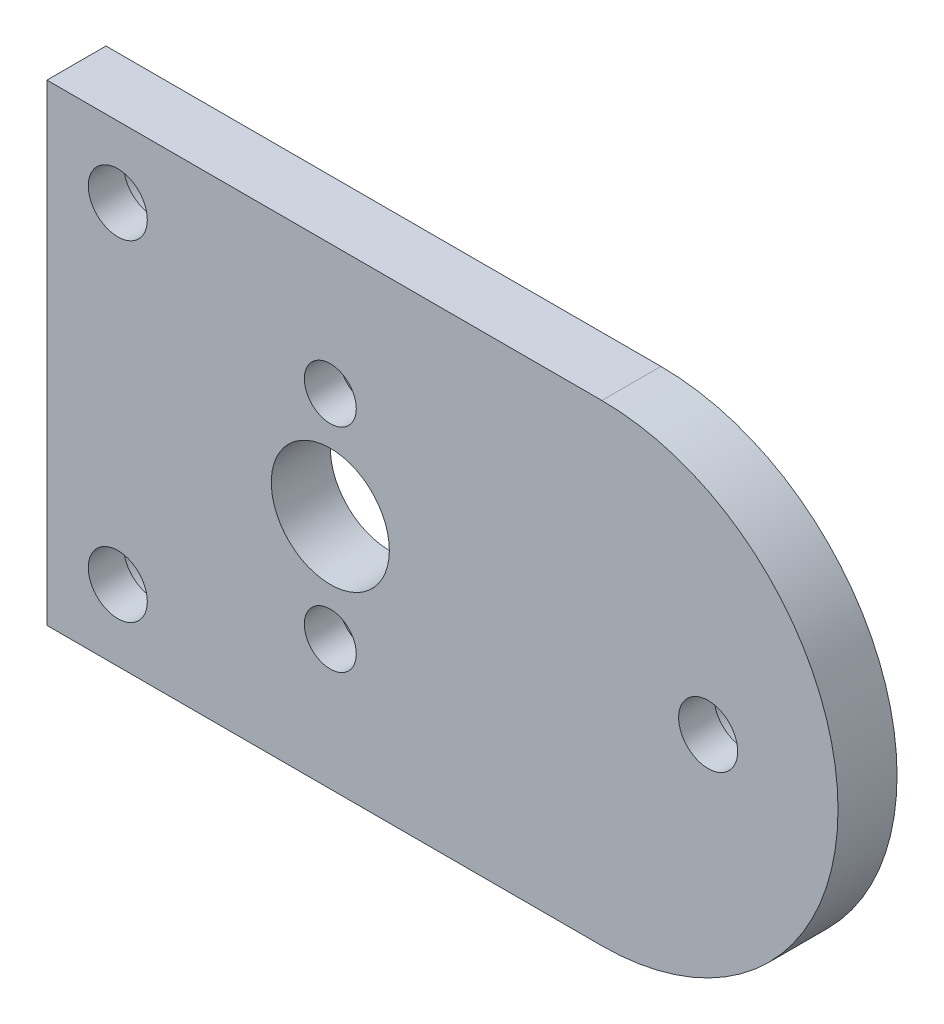
ISO-10303-21;
HEADER;
FILE_DESCRIPTION(('STEP AP214'),'2;1');
FILE_NAME('part.step','',(''),(''),'','','');
FILE_SCHEMA(('AUTOMOTIVE_DESIGN { 1 0 10303 214 1 1 1 1 }'));
ENDSEC;
DATA;
#1=APPLICATION_CONTEXT('core data for automotive mechanical design processes');
#2=APPLICATION_PROTOCOL_DEFINITION('international standard','automotive_design',2000,#1);
#3=PRODUCT_CONTEXT('',#1,'mechanical');
#4=PRODUCT('Part','Part','',(#3));
#5=PRODUCT_RELATED_PRODUCT_CATEGORY('part','',(#4));
#6=PRODUCT_DEFINITION_FORMATION('','',#4);
#7=PRODUCT_DEFINITION_CONTEXT('part definition',#1,'design');
#8=PRODUCT_DEFINITION('design','',#6,#7);
#9=PRODUCT_DEFINITION_SHAPE('','',#8);
#10=(LENGTH_UNIT() NAMED_UNIT(*) SI_UNIT(.MILLI.,.METRE.));
#11=(NAMED_UNIT(*) PLANE_ANGLE_UNIT() SI_UNIT($,.RADIAN.));
#12=(NAMED_UNIT(*) SI_UNIT($,.STERADIAN.) SOLID_ANGLE_UNIT());
#13=UNCERTAINTY_MEASURE_WITH_UNIT(LENGTH_MEASURE(1.E-05),#10,'distance_accuracy_value','');
#14=(GEOMETRIC_REPRESENTATION_CONTEXT(3) GLOBAL_UNCERTAINTY_ASSIGNED_CONTEXT((#13)) GLOBAL_UNIT_ASSIGNED_CONTEXT((#10,
#11,#12)) REPRESENTATION_CONTEXT('',''));
#15=CARTESIAN_POINT('',(0.,0.,0.));
#16=DIRECTION('',(0.,0.,1.));
#17=DIRECTION('',(1.,0.,0.));
#18=AXIS2_PLACEMENT_3D('',#15,#16,#17);
#19=CARTESIAN_POINT('',(0.,4.5,1.25));
#20=DIRECTION('',(0.,0.,-1.));
#21=DIRECTION('',(-1.,0.,0.));
#22=AXIS2_PLACEMENT_3D('',#19,#20,#21);
#23=CYLINDRICAL_SURFACE('',#22,0.85);
#24=CARTESIAN_POINT('',(0.,4.5,-1.25));
#25=DIRECTION('',(0.,0.,1.));
#26=DIRECTION('',(1.,0.,0.));
#27=AXIS2_PLACEMENT_3D('',#24,#25,#26);
#28=CIRCLE('',#27,0.85);
#29=CARTESIAN_POINT('',(0.849999999999998,4.5,-1.25));
#30=VERTEX_POINT('',#29);
#31=EDGE_CURVE('E184',#30,#30,#28,.T.);
#32=ORIENTED_EDGE('',*,*,#31,.F.);
#33=EDGE_LOOP('',(#32));
#34=FACE_BOUND('',#33,.T.);
#35=CARTESIAN_POINT('',(0.,4.5,-0.25));
#36=DIRECTION('',(0.,0.,1.));
#37=DIRECTION('',(1.,0.,0.));
#38=AXIS2_PLACEMENT_3D('',#35,#36,#37);
#39=CIRCLE('',#38,0.85);
#40=CARTESIAN_POINT('',(0.849999999999998,4.5,-0.25));
#41=VERTEX_POINT('',#40);
#42=EDGE_CURVE('E197',#41,#41,#39,.T.);
#43=ORIENTED_EDGE('',*,*,#42,.T.);
#44=EDGE_LOOP('',(#43));
#45=FACE_BOUND('',#44,.T.);
#46=ADVANCED_FACE('F118',(#34,#45),#23,.F.);
#47=CARTESIAN_POINT('',(0.,-4.5,1.25));
#48=DIRECTION('',(0.,0.,-1.));
#49=DIRECTION('',(-1.,0.,0.));
#50=AXIS2_PLACEMENT_3D('',#47,#48,#49);
#51=CYLINDRICAL_SURFACE('',#50,0.85);
#52=CARTESIAN_POINT('',(0.,-4.5,-1.25));
#53=DIRECTION('',(0.,0.,1.));
#54=DIRECTION('',(1.,0.,0.));
#55=AXIS2_PLACEMENT_3D('',#52,#53,#54);
#56=CIRCLE('',#55,0.85);
#57=CARTESIAN_POINT('',(0.850000000000001,-4.5,-1.25));
#58=VERTEX_POINT('',#57);
#59=EDGE_CURVE('E188',#58,#58,#56,.T.);
#60=ORIENTED_EDGE('',*,*,#59,.F.);
#61=EDGE_LOOP('',(#60));
#62=FACE_BOUND('',#61,.T.);
#63=CARTESIAN_POINT('',(0.,-4.5,-0.25));
#64=DIRECTION('',(0.,0.,1.));
#65=DIRECTION('',(1.,0.,0.));
#66=AXIS2_PLACEMENT_3D('',#63,#64,#65);
#67=CIRCLE('',#66,0.85);
#68=CARTESIAN_POINT('',(0.850000000000001,-4.5,-0.25));
#69=VERTEX_POINT('',#68);
#70=EDGE_CURVE('E208',#69,#69,#67,.T.);
#71=ORIENTED_EDGE('',*,*,#70,.T.);
#72=EDGE_LOOP('',(#71));
#73=FACE_BOUND('',#72,.T.);
#74=ADVANCED_FACE('F265',(#62,#73),#51,.F.);
#75=CARTESIAN_POINT('',(0.,10.0000000000001,1.25));
#76=DIRECTION('',(0.,-1.,0.));
#77=DIRECTION('',(1.,0.,0.));
#78=AXIS2_PLACEMENT_3D('',#75,#76,#77);
#79=PLANE('',#78);
#80=DIRECTION('',(-1.,0.,0.));
#81=VECTOR('',#80,1.);
#82=CARTESIAN_POINT('',(0.,10.0000000000001,-1.25));
#83=LINE('',#82,#81);
#84=CARTESIAN_POINT('',(11.5,10.,-1.25));
#85=VERTEX_POINT('',#84);
#86=CARTESIAN_POINT('',(-12.,10.,-1.25));
#87=VERTEX_POINT('',#86);
#88=EDGE_CURVE('E161',#85,#87,#83,.T.);
#89=ORIENTED_EDGE('',*,*,#88,.T.);
#90=DIRECTION('',(0.,0.,-1.));
#91=VECTOR('',#90,1.);
#92=CARTESIAN_POINT('',(-12.,10.,1.25));
#93=LINE('',#92,#91);
#94=CARTESIAN_POINT('',(-12.,10.,1.25));
#95=VERTEX_POINT('',#94);
#96=EDGE_CURVE('E13',#95,#87,#93,.T.);
#97=ORIENTED_EDGE('',*,*,#96,.F.);
#98=DIRECTION('',(-1.,0.,0.));
#99=VECTOR('',#98,1.);
#100=CARTESIAN_POINT('',(0.,10.0000000000001,1.25));
#101=LINE('',#100,#99);
#102=CARTESIAN_POINT('',(11.5,10.,1.25));
#103=VERTEX_POINT('',#102);
#104=EDGE_CURVE('E176',#103,#95,#101,.T.);
#105=ORIENTED_EDGE('',*,*,#104,.F.);
#106=DIRECTION('',(0.,0.,-1.));
#107=VECTOR('',#106,1.);
#108=CARTESIAN_POINT('',(11.5,10.,1.25));
#109=LINE('',#108,#107);
#110=EDGE_CURVE('E174',#103,#85,#109,.T.);
#111=ORIENTED_EDGE('',*,*,#110,.T.);
#112=EDGE_LOOP('',(#89,#97,#105,#111));
#113=FACE_BOUND('',#112,.T.);
#114=ADVANCED_FACE('F175',(#113),#79,.F.);
#115=CARTESIAN_POINT('',(-12.,0.,1.25));
#116=DIRECTION('',(1.,0.,0.));
#117=DIRECTION('',(0.,1.,0.));
#118=AXIS2_PLACEMENT_3D('',#115,#116,#117);
#119=PLANE('',#118);
#120=DIRECTION('',(0.,-1.,0.));
#121=VECTOR('',#120,1.);
#122=CARTESIAN_POINT('',(-12.,0.,-1.25));
#123=LINE('',#122,#121);
#124=CARTESIAN_POINT('',(-12.,-10.,-1.25));
#125=VERTEX_POINT('',#124);
#126=EDGE_CURVE('E168',#87,#125,#123,.T.);
#127=ORIENTED_EDGE('',*,*,#126,.T.);
#128=DIRECTION('',(0.,0.,-1.));
#129=VECTOR('',#128,1.);
#130=CARTESIAN_POINT('',(-12.,-10.,1.25));
#131=LINE('',#130,#129);
#132=CARTESIAN_POINT('',(-12.,-10.,1.25));
#133=VERTEX_POINT('',#132);
#134=EDGE_CURVE('E127',#133,#125,#131,.T.);
#135=ORIENTED_EDGE('',*,*,#134,.F.);
#136=DIRECTION('',(0.,-1.,0.));
#137=VECTOR('',#136,1.);
#138=CARTESIAN_POINT('',(-12.,0.,1.25));
#139=LINE('',#138,#137);
#140=EDGE_CURVE('E136',#95,#133,#139,.T.);
#141=ORIENTED_EDGE('',*,*,#140,.F.);
#142=ORIENTED_EDGE('',*,*,#96,.T.);
#143=EDGE_LOOP('',(#127,#135,#141,#142));
#144=FACE_BOUND('',#143,.T.);
#145=ADVANCED_FACE('F245',(#144),#119,.F.);
#146=CARTESIAN_POINT('',(0.,-10.,1.25));
#147=DIRECTION('',(0.,-1.,0.));
#148=DIRECTION('',(0.,0.,-1.));
#149=AXIS2_PLACEMENT_3D('',#146,#147,#148);
#150=PLANE('',#149);
#151=DIRECTION('',(-1.,0.,0.));
#152=VECTOR('',#151,1.);
#153=CARTESIAN_POINT('',(0.,-10.,-1.25));
#154=LINE('',#153,#152);
#155=CARTESIAN_POINT('',(11.5,-10.,-1.25));
#156=VERTEX_POINT('',#155);
#157=EDGE_CURVE('E155',#156,#125,#154,.T.);
#158=ORIENTED_EDGE('',*,*,#157,.F.);
#159=DIRECTION('',(0.,0.,-1.));
#160=VECTOR('',#159,1.);
#161=CARTESIAN_POINT('',(11.5,-10.,1.25));
#162=LINE('',#161,#160);
#163=CARTESIAN_POINT('',(11.5,-10.,1.25));
#164=VERTEX_POINT('',#163);
#165=EDGE_CURVE('E171',#164,#156,#162,.T.);
#166=ORIENTED_EDGE('',*,*,#165,.F.);
#167=DIRECTION('',(-1.,0.,0.));
#168=VECTOR('',#167,1.);
#169=CARTESIAN_POINT('',(0.,-10.,1.25));
#170=LINE('',#169,#168);
#171=EDGE_CURVE('E238',#164,#133,#170,.T.);
#172=ORIENTED_EDGE('',*,*,#171,.T.);
#173=ORIENTED_EDGE('',*,*,#134,.T.);
#174=EDGE_LOOP('',(#158,#166,#172,#173));
#175=FACE_BOUND('',#174,.T.);
#176=ADVANCED_FACE('F243',(#175),#150,.T.);
#177=CARTESIAN_POINT('',(0.,0.,1.25));
#178=DIRECTION('',(0.,0.,1.));
#179=DIRECTION('',(1.,0.,0.));
#180=AXIS2_PLACEMENT_3D('',#177,#178,#179);
#181=PLANE('',#180);
#182=CARTESIAN_POINT('',(0.,4.5,1.25));
#183=DIRECTION('',(0.,0.,1.));
#184=DIRECTION('',(1.,0.,0.));
#185=AXIS2_PLACEMENT_3D('',#182,#183,#184);
#186=CIRCLE('',#185,1.1);
#187=CARTESIAN_POINT('',(1.1,4.5,1.25));
#188=VERTEX_POINT('',#187);
#189=EDGE_CURVE('E231',#188,#188,#186,.T.);
#190=ORIENTED_EDGE('',*,*,#189,.F.);
#191=EDGE_LOOP('',(#190));
#192=FACE_BOUND('',#191,.T.);
#193=CARTESIAN_POINT('',(0.,-4.5,1.25));
#194=DIRECTION('',(0.,0.,1.));
#195=DIRECTION('',(1.,0.,0.));
#196=AXIS2_PLACEMENT_3D('',#193,#194,#195);
#197=CIRCLE('',#196,1.1);
#198=CARTESIAN_POINT('',(1.1,-4.5,1.25));
#199=VERTEX_POINT('',#198);
#200=EDGE_CURVE('E226',#199,#199,#197,.T.);
#201=ORIENTED_EDGE('',*,*,#200,.F.);
#202=EDGE_LOOP('',(#201));
#203=FACE_BOUND('',#202,.T.);
#204=ORIENTED_EDGE('',*,*,#104,.T.);
#205=ORIENTED_EDGE('',*,*,#140,.T.);
#206=ORIENTED_EDGE('',*,*,#171,.F.);
#207=CARTESIAN_POINT('',(11.5,0.,1.25));
#208=DIRECTION('',(0.,0.,1.));
#209=DIRECTION('',(1.,0.,0.));
#210=AXIS2_PLACEMENT_3D('',#207,#208,#209);
#211=CIRCLE('',#210,10.);
#212=EDGE_CURVE('E183',#164,#103,#211,.T.);
#213=ORIENTED_EDGE('',*,*,#212,.T.);
#214=EDGE_LOOP('',(#204,#205,#206,#213));
#215=FACE_BOUND('',#214,.T.);
#216=CARTESIAN_POINT('',(-9.00000000000001,7.,1.25));
#217=DIRECTION('',(0.,0.,1.));
#218=DIRECTION('',(1.,0.,0.));
#219=AXIS2_PLACEMENT_3D('',#216,#217,#218);
#220=CIRCLE('',#219,1.25);
#221=CARTESIAN_POINT('',(-7.75000000000001,7.,1.25));
#222=VERTEX_POINT('',#221);
#223=EDGE_CURVE('E196',#222,#222,#220,.T.);
#224=ORIENTED_EDGE('',*,*,#223,.F.);
#225=EDGE_LOOP('',(#224));
#226=FACE_BOUND('',#225,.T.);
#227=CARTESIAN_POINT('',(0.,0.,1.25));
#228=DIRECTION('',(0.,0.,1.));
#229=DIRECTION('',(1.,0.,0.));
#230=AXIS2_PLACEMENT_3D('',#227,#228,#229);
#231=CIRCLE('',#230,2.5);
#232=CARTESIAN_POINT('',(2.5,0.,1.25));
#233=VERTEX_POINT('',#232);
#234=EDGE_CURVE('E201',#233,#233,#231,.T.);
#235=ORIENTED_EDGE('',*,*,#234,.F.);
#236=EDGE_LOOP('',(#235));
#237=FACE_BOUND('',#236,.T.);
#238=CARTESIAN_POINT('',(-9.00000000000001,-7.,1.25));
#239=DIRECTION('',(0.,0.,1.));
#240=DIRECTION('',(1.,0.,0.));
#241=AXIS2_PLACEMENT_3D('',#238,#239,#240);
#242=CIRCLE('',#241,1.25);
#243=CARTESIAN_POINT('',(-7.75,-7.,1.25));
#244=VERTEX_POINT('',#243);
#245=EDGE_CURVE('E193',#244,#244,#242,.T.);
#246=ORIENTED_EDGE('',*,*,#245,.F.);
#247=EDGE_LOOP('',(#246));
#248=FACE_BOUND('',#247,.T.);
#249=CARTESIAN_POINT('',(16.,0.,1.25));
#250=DIRECTION('',(0.,0.,1.));
#251=DIRECTION('',(1.,0.,0.));
#252=AXIS2_PLACEMENT_3D('',#249,#250,#251);
#253=CIRCLE('',#252,1.25);
#254=CARTESIAN_POINT('',(17.25,0.,1.25));
#255=VERTEX_POINT('',#254);
#256=EDGE_CURVE('E180',#255,#255,#253,.T.);
#257=ORIENTED_EDGE('',*,*,#256,.F.);
#258=EDGE_LOOP('',(#257));
#259=FACE_BOUND('',#258,.T.);
#260=ADVANCED_FACE('F246',(#192,#203,#215,#226,#237,#248,#259),#181,.T.);
#261=CARTESIAN_POINT('',(0.,0.,-1.25));
#262=DIRECTION('',(0.,0.,1.));
#263=DIRECTION('',(1.,0.,0.));
#264=AXIS2_PLACEMENT_3D('',#261,#262,#263);
#265=PLANE('',#264);
#266=CARTESIAN_POINT('',(16.,0.,-1.25));
#267=DIRECTION('',(0.,0.,1.));
#268=DIRECTION('',(1.,0.,0.));
#269=AXIS2_PLACEMENT_3D('',#266,#267,#268);
#270=CIRCLE('',#269,2.);
#271=CARTESIAN_POINT('',(18.,0.,-1.25));
#272=VERTEX_POINT('',#271);
#273=EDGE_CURVE('E313',#272,#272,#270,.T.);
#274=ORIENTED_EDGE('',*,*,#273,.T.);
#275=EDGE_LOOP('',(#274));
#276=FACE_BOUND('',#275,.T.);
#277=CARTESIAN_POINT('',(-9.00000000000001,-7.,-1.25));
#278=DIRECTION('',(0.,0.,1.));
#279=DIRECTION('',(1.,0.,0.));
#280=AXIS2_PLACEMENT_3D('',#277,#278,#279);
#281=CIRCLE('',#280,2.);
#282=CARTESIAN_POINT('',(-7.00000000000001,-7.,-1.25));
#283=VERTEX_POINT('',#282);
#284=EDGE_CURVE('E310',#283,#283,#281,.T.);
#285=ORIENTED_EDGE('',*,*,#284,.T.);
#286=EDGE_LOOP('',(#285));
#287=FACE_BOUND('',#286,.T.);
#288=CARTESIAN_POINT('',(-9.00000000000001,7.,-1.25));
#289=DIRECTION('',(0.,0.,1.));
#290=DIRECTION('',(1.,0.,0.));
#291=AXIS2_PLACEMENT_3D('',#288,#289,#290);
#292=CIRCLE('',#291,2.);
#293=CARTESIAN_POINT('',(-7.,7.,-1.25));
#294=VERTEX_POINT('',#293);
#295=EDGE_CURVE('E303',#294,#294,#292,.T.);
#296=ORIENTED_EDGE('',*,*,#295,.T.);
#297=EDGE_LOOP('',(#296));
#298=FACE_BOUND('',#297,.T.);
#299=ORIENTED_EDGE('',*,*,#88,.F.);
#300=CARTESIAN_POINT('',(11.5,0.,-1.25));
#301=DIRECTION('',(0.,0.,1.));
#302=DIRECTION('',(1.,0.,0.));
#303=AXIS2_PLACEMENT_3D('',#300,#301,#302);
#304=CIRCLE('',#303,10.);
#305=EDGE_CURVE('E166',#156,#85,#304,.T.);
#306=ORIENTED_EDGE('',*,*,#305,.F.);
#307=ORIENTED_EDGE('',*,*,#157,.T.);
#308=ORIENTED_EDGE('',*,*,#126,.F.);
#309=EDGE_LOOP('',(#299,#306,#307,#308));
#310=FACE_BOUND('',#309,.T.);
#311=ORIENTED_EDGE('',*,*,#31,.T.);
#312=EDGE_LOOP('',(#311));
#313=FACE_BOUND('',#312,.T.);
#314=ORIENTED_EDGE('',*,*,#59,.T.);
#315=EDGE_LOOP('',(#314));
#316=FACE_BOUND('',#315,.T.);
#317=CARTESIAN_POINT('',(0.,0.,-1.25));
#318=DIRECTION('',(0.,0.,1.));
#319=DIRECTION('',(1.,0.,0.));
#320=AXIS2_PLACEMENT_3D('',#317,#318,#319);
#321=CIRCLE('',#320,2.5);
#322=CARTESIAN_POINT('',(2.5,0.,-1.25));
#323=VERTEX_POINT('',#322);
#324=EDGE_CURVE('E200',#323,#323,#321,.T.);
#325=ORIENTED_EDGE('',*,*,#324,.T.);
#326=EDGE_LOOP('',(#325));
#327=FACE_BOUND('',#326,.T.);
#328=ADVANCED_FACE('F163',(#276,#287,#298,#310,#313,#316,#327),#265,.F.);
#329=CARTESIAN_POINT('',(16.,0.,1.25));
#330=DIRECTION('',(0.,0.,-1.));
#331=DIRECTION('',(-1.,0.,0.));
#332=AXIS2_PLACEMENT_3D('',#329,#330,#331);
#333=CYLINDRICAL_SURFACE('',#332,1.25);
#334=CARTESIAN_POINT('',(16.,0.,-0.25));
#335=DIRECTION('',(0.,0.,1.));
#336=DIRECTION('',(1.,0.,0.));
#337=AXIS2_PLACEMENT_3D('',#334,#335,#336);
#338=CIRCLE('',#337,1.25);
#339=CARTESIAN_POINT('',(17.25,0.,-0.25));
#340=VERTEX_POINT('',#339);
#341=EDGE_CURVE('E121',#340,#340,#338,.T.);
#342=ORIENTED_EDGE('',*,*,#341,.F.);
#343=EDGE_LOOP('',(#342));
#344=FACE_BOUND('',#343,.T.);
#345=ORIENTED_EDGE('',*,*,#256,.T.);
#346=EDGE_LOOP('',(#345));
#347=FACE_BOUND('',#346,.T.);
#348=ADVANCED_FACE('F260',(#344,#347),#333,.F.);
#349=CARTESIAN_POINT('',(-9.00000000000001,-7.,1.25));
#350=DIRECTION('',(0.,0.,-1.));
#351=DIRECTION('',(-1.,0.,0.));
#352=AXIS2_PLACEMENT_3D('',#349,#350,#351);
#353=CYLINDRICAL_SURFACE('',#352,1.25);
#354=CARTESIAN_POINT('',(-9.00000000000001,-7.,-0.25));
#355=DIRECTION('',(0.,0.,1.));
#356=DIRECTION('',(1.,0.,0.));
#357=AXIS2_PLACEMENT_3D('',#354,#355,#356);
#358=CIRCLE('',#357,1.25);
#359=CARTESIAN_POINT('',(-7.75,-7.,-0.25));
#360=VERTEX_POINT('',#359);
#361=EDGE_CURVE('E216',#360,#360,#358,.T.);
#362=ORIENTED_EDGE('',*,*,#361,.F.);
#363=EDGE_LOOP('',(#362));
#364=FACE_BOUND('',#363,.T.);
#365=ORIENTED_EDGE('',*,*,#245,.T.);
#366=EDGE_LOOP('',(#365));
#367=FACE_BOUND('',#366,.T.);
#368=ADVANCED_FACE('F262',(#364,#367),#353,.F.);
#369=CARTESIAN_POINT('',(0.,0.,1.25));
#370=DIRECTION('',(0.,0.,-1.));
#371=DIRECTION('',(-1.,0.,0.));
#372=AXIS2_PLACEMENT_3D('',#369,#370,#371);
#373=CYLINDRICAL_SURFACE('',#372,2.5);
#374=ORIENTED_EDGE('',*,*,#234,.T.);
#375=EDGE_LOOP('',(#374));
#376=FACE_BOUND('',#375,.T.);
#377=ORIENTED_EDGE('',*,*,#324,.F.);
#378=EDGE_LOOP('',(#377));
#379=FACE_BOUND('',#378,.T.);
#380=ADVANCED_FACE('F270',(#376,#379),#373,.F.);
#381=CARTESIAN_POINT('',(-9.00000000000001,7.,1.25));
#382=DIRECTION('',(0.,0.,-1.));
#383=DIRECTION('',(-1.,0.,0.));
#384=AXIS2_PLACEMENT_3D('',#381,#382,#383);
#385=CYLINDRICAL_SURFACE('',#384,1.25);
#386=CARTESIAN_POINT('',(-9.00000000000001,7.,-0.25));
#387=DIRECTION('',(0.,0.,1.));
#388=DIRECTION('',(1.,0.,0.));
#389=AXIS2_PLACEMENT_3D('',#386,#387,#388);
#390=CIRCLE('',#389,1.25);
#391=CARTESIAN_POINT('',(-7.75000000000001,7.,-0.25));
#392=VERTEX_POINT('',#391);
#393=EDGE_CURVE('E214',#392,#392,#390,.T.);
#394=ORIENTED_EDGE('',*,*,#393,.F.);
#395=EDGE_LOOP('',(#394));
#396=FACE_BOUND('',#395,.T.);
#397=ORIENTED_EDGE('',*,*,#223,.T.);
#398=EDGE_LOOP('',(#397));
#399=FACE_BOUND('',#398,.T.);
#400=ADVANCED_FACE('F273',(#396,#399),#385,.F.);
#401=CARTESIAN_POINT('',(11.5,0.,1.25));
#402=DIRECTION('',(0.,0.,-1.));
#403=DIRECTION('',(-1.,0.,0.));
#404=AXIS2_PLACEMENT_3D('',#401,#402,#403);
#405=CYLINDRICAL_SURFACE('',#404,10.);
#406=ORIENTED_EDGE('',*,*,#305,.T.);
#407=ORIENTED_EDGE('',*,*,#110,.F.);
#408=ORIENTED_EDGE('',*,*,#212,.F.);
#409=ORIENTED_EDGE('',*,*,#165,.T.);
#410=EDGE_LOOP('',(#406,#407,#408,#409));
#411=FACE_BOUND('',#410,.T.);
#412=ADVANCED_FACE('F182',(#411),#405,.T.);
#413=CARTESIAN_POINT('',(0.,-4.5,-4.36126983722081));
#414=DIRECTION('',(0.,0.,1.));
#415=DIRECTION('',(1.,0.,0.));
#416=AXIS2_PLACEMENT_3D('',#413,#414,#415);
#417=CYLINDRICAL_SURFACE('',#416,1.1);
#418=CARTESIAN_POINT('',(0.,-4.5,-0.25));
#419=DIRECTION('',(0.,0.,1.));
#420=DIRECTION('',(1.,0.,0.));
#421=AXIS2_PLACEMENT_3D('',#418,#419,#420);
#422=CIRCLE('',#421,1.1);
#423=CARTESIAN_POINT('',(1.1,-4.5,-0.25));
#424=VERTEX_POINT('',#423);
#425=EDGE_CURVE('E222',#424,#424,#422,.F.);
#426=ORIENTED_EDGE('',*,*,#425,.T.);
#427=EDGE_LOOP('',(#426));
#428=FACE_BOUND('',#427,.T.);
#429=ORIENTED_EDGE('',*,*,#200,.T.);
#430=EDGE_LOOP('',(#429));
#431=FACE_BOUND('',#430,.T.);
#432=ADVANCED_FACE('F276',(#428,#431),#417,.F.);
#433=CARTESIAN_POINT('',(0.,0.,-0.25));
#434=DIRECTION('',(0.,0.,1.));
#435=DIRECTION('',(1.,0.,0.));
#436=AXIS2_PLACEMENT_3D('',#433,#434,#435);
#437=PLANE('',#436);
#438=ORIENTED_EDGE('',*,*,#70,.F.);
#439=EDGE_LOOP('',(#438));
#440=FACE_BOUND('',#439,.T.);
#441=ORIENTED_EDGE('',*,*,#425,.F.);
#442=EDGE_LOOP('',(#441));
#443=FACE_BOUND('',#442,.T.);
#444=ADVANCED_FACE('F350',(#440,#443),#437,.T.);
#445=CARTESIAN_POINT('',(0.,4.5,-4.36126983722081));
#446=DIRECTION('',(0.,0.,1.));
#447=DIRECTION('',(1.,0.,0.));
#448=AXIS2_PLACEMENT_3D('',#445,#446,#447);
#449=CYLINDRICAL_SURFACE('',#448,1.1);
#450=CARTESIAN_POINT('',(0.,4.5,-0.25));
#451=DIRECTION('',(0.,0.,1.));
#452=DIRECTION('',(1.,0.,0.));
#453=AXIS2_PLACEMENT_3D('',#450,#451,#452);
#454=CIRCLE('',#453,1.1);
#455=CARTESIAN_POINT('',(1.1,4.5,-0.25));
#456=VERTEX_POINT('',#455);
#457=EDGE_CURVE('E211',#456,#456,#454,.F.);
#458=ORIENTED_EDGE('',*,*,#457,.T.);
#459=EDGE_LOOP('',(#458));
#460=FACE_BOUND('',#459,.T.);
#461=ORIENTED_EDGE('',*,*,#189,.T.);
#462=EDGE_LOOP('',(#461));
#463=FACE_BOUND('',#462,.T.);
#464=ADVANCED_FACE('F294',(#460,#463),#449,.F.);
#465=CARTESIAN_POINT('',(0.,0.,-0.25));
#466=DIRECTION('',(0.,0.,1.));
#467=DIRECTION('',(1.,0.,0.));
#468=AXIS2_PLACEMENT_3D('',#465,#466,#467);
#469=PLANE('',#468);
#470=ORIENTED_EDGE('',*,*,#42,.F.);
#471=EDGE_LOOP('',(#470));
#472=FACE_BOUND('',#471,.T.);
#473=ORIENTED_EDGE('',*,*,#457,.F.);
#474=EDGE_LOOP('',(#473));
#475=FACE_BOUND('',#474,.T.);
#476=ADVANCED_FACE('F290',(#472,#475),#469,.T.);
#477=CARTESIAN_POINT('',(-9.00000000000001,7.,6.90685424949238));
#478=DIRECTION('',(0.,0.,-1.));
#479=DIRECTION('',(-1.,0.,0.));
#480=AXIS2_PLACEMENT_3D('',#477,#478,#479);
#481=CYLINDRICAL_SURFACE('',#480,2.);
#482=ORIENTED_EDGE('',*,*,#295,.F.);
#483=EDGE_LOOP('',(#482));
#484=FACE_BOUND('',#483,.T.);
#485=CARTESIAN_POINT('',(-9.00000000000001,7.,-0.25));
#486=DIRECTION('',(0.,0.,1.));
#487=DIRECTION('',(1.,0.,0.));
#488=AXIS2_PLACEMENT_3D('',#485,#486,#487);
#489=CIRCLE('',#488,2.);
#490=CARTESIAN_POINT('',(-7.,7.,-0.25));
#491=VERTEX_POINT('',#490);
#492=EDGE_CURVE('E307',#491,#491,#489,.T.);
#493=ORIENTED_EDGE('',*,*,#492,.T.);
#494=EDGE_LOOP('',(#493));
#495=FACE_BOUND('',#494,.T.);
#496=ADVANCED_FACE('F293',(#484,#495),#481,.F.);
#497=CARTESIAN_POINT('',(0.,0.,-0.25));
#498=DIRECTION('',(0.,0.,1.));
#499=DIRECTION('',(1.,0.,0.));
#500=AXIS2_PLACEMENT_3D('',#497,#498,#499);
#501=PLANE('',#500);
#502=ORIENTED_EDGE('',*,*,#393,.T.);
#503=EDGE_LOOP('',(#502));
#504=FACE_BOUND('',#503,.T.);
#505=ORIENTED_EDGE('',*,*,#492,.F.);
#506=EDGE_LOOP('',(#505));
#507=FACE_BOUND('',#506,.T.);
#508=ADVANCED_FACE('F340',(#504,#507),#501,.F.);
#509=CARTESIAN_POINT('',(-9.00000000000001,-7.,6.90685424949238));
#510=DIRECTION('',(0.,0.,-1.));
#511=DIRECTION('',(-1.,0.,0.));
#512=AXIS2_PLACEMENT_3D('',#509,#510,#511);
#513=CYLINDRICAL_SURFACE('',#512,2.);
#514=ORIENTED_EDGE('',*,*,#284,.F.);
#515=EDGE_LOOP('',(#514));
#516=FACE_BOUND('',#515,.T.);
#517=CARTESIAN_POINT('',(-9.00000000000001,-7.,-0.25));
#518=DIRECTION('',(0.,0.,1.));
#519=DIRECTION('',(1.,0.,0.));
#520=AXIS2_PLACEMENT_3D('',#517,#518,#519);
#521=CIRCLE('',#520,2.);
#522=CARTESIAN_POINT('',(-7.00000000000001,-7.,-0.25));
#523=VERTEX_POINT('',#522);
#524=EDGE_CURVE('E306',#523,#523,#521,.T.);
#525=ORIENTED_EDGE('',*,*,#524,.T.);
#526=EDGE_LOOP('',(#525));
#527=FACE_BOUND('',#526,.T.);
#528=ADVANCED_FACE('F337',(#516,#527),#513,.F.);
#529=CARTESIAN_POINT('',(0.,0.,-0.25));
#530=DIRECTION('',(0.,0.,1.));
#531=DIRECTION('',(1.,0.,0.));
#532=AXIS2_PLACEMENT_3D('',#529,#530,#531);
#533=PLANE('',#532);
#534=ORIENTED_EDGE('',*,*,#361,.T.);
#535=EDGE_LOOP('',(#534));
#536=FACE_BOUND('',#535,.T.);
#537=ORIENTED_EDGE('',*,*,#524,.F.);
#538=EDGE_LOOP('',(#537));
#539=FACE_BOUND('',#538,.T.);
#540=ADVANCED_FACE('F326',(#536,#539),#533,.F.);
#541=CARTESIAN_POINT('',(16.,0.,6.90685424949238));
#542=DIRECTION('',(0.,0.,-1.));
#543=DIRECTION('',(-1.,0.,0.));
#544=AXIS2_PLACEMENT_3D('',#541,#542,#543);
#545=CYLINDRICAL_SURFACE('',#544,2.);
#546=ORIENTED_EDGE('',*,*,#273,.F.);
#547=EDGE_LOOP('',(#546));
#548=FACE_BOUND('',#547,.T.);
#549=CARTESIAN_POINT('',(16.,0.,-0.25));
#550=DIRECTION('',(0.,0.,1.));
#551=DIRECTION('',(1.,0.,0.));
#552=AXIS2_PLACEMENT_3D('',#549,#550,#551);
#553=CIRCLE('',#552,2.);
#554=CARTESIAN_POINT('',(18.,0.,-0.25));
#555=VERTEX_POINT('',#554);
#556=EDGE_CURVE('E217',#555,#555,#553,.T.);
#557=ORIENTED_EDGE('',*,*,#556,.T.);
#558=EDGE_LOOP('',(#557));
#559=FACE_BOUND('',#558,.T.);
#560=ADVANCED_FACE('F322',(#548,#559),#545,.F.);
#561=CARTESIAN_POINT('',(0.,0.,-0.25));
#562=DIRECTION('',(0.,0.,1.));
#563=DIRECTION('',(1.,0.,0.));
#564=AXIS2_PLACEMENT_3D('',#561,#562,#563);
#565=PLANE('',#564);
#566=ORIENTED_EDGE('',*,*,#341,.T.);
#567=EDGE_LOOP('',(#566));
#568=FACE_BOUND('',#567,.T.);
#569=ORIENTED_EDGE('',*,*,#556,.F.);
#570=EDGE_LOOP('',(#569));
#571=FACE_BOUND('',#570,.T.);
#572=ADVANCED_FACE('F325',(#568,#571),#565,.F.);
#573=CLOSED_SHELL('',(#46,#74,#114,#145,#176,#260,#328,#348,#368,#380,#400,#412,#432,#444,#464,
#476,#496,#508,#528,#540,#560,#572));
#574=MANIFOLD_SOLID_BREP('B2',#573);
#575=ADVANCED_BREP_SHAPE_REPRESENTATION('',(#18,#574),#14);
#576=SHAPE_DEFINITION_REPRESENTATION(#9,#575);
ENDSEC;
END-ISO-10303-21;
